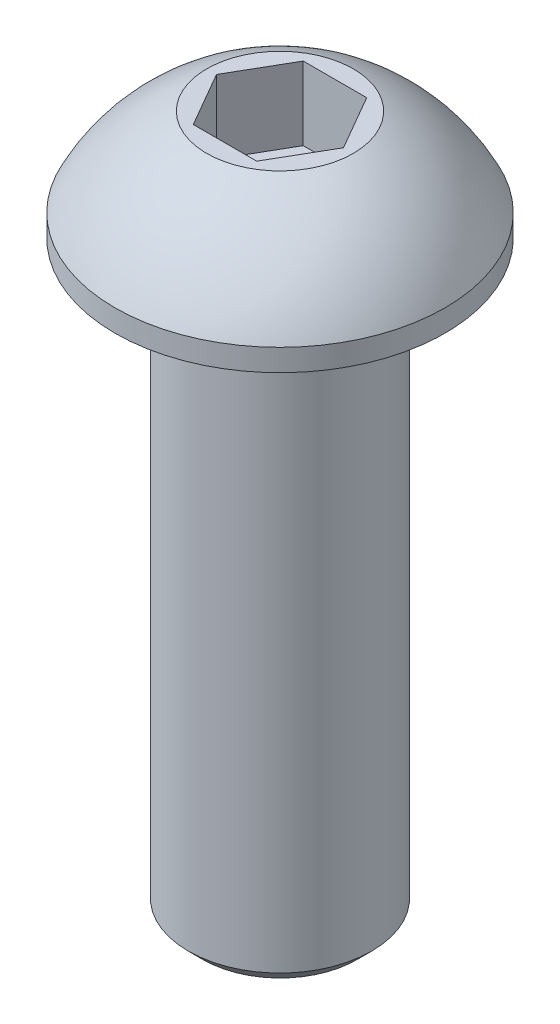
ISO-10303-21;
HEADER;
FILE_DESCRIPTION(('STEP AP214'),'2;1');
FILE_NAME('part.step','',(''),(''),'','','');
FILE_SCHEMA(('AUTOMOTIVE_DESIGN { 1 0 10303 214 1 1 1 1 }'));
ENDSEC;
DATA;
#1=APPLICATION_CONTEXT('core data for automotive mechanical design processes');
#2=APPLICATION_PROTOCOL_DEFINITION('international standard','automotive_design',2000,#1);
#3=PRODUCT_CONTEXT('',#1,'mechanical');
#4=PRODUCT('Part','Part','',(#3));
#5=PRODUCT_RELATED_PRODUCT_CATEGORY('part','',(#4));
#6=PRODUCT_DEFINITION_FORMATION('','',#4);
#7=PRODUCT_DEFINITION_CONTEXT('part definition',#1,'design');
#8=PRODUCT_DEFINITION('design','',#6,#7);
#9=PRODUCT_DEFINITION_SHAPE('','',#8);
#10=(LENGTH_UNIT() NAMED_UNIT(*) SI_UNIT(.MILLI.,.METRE.));
#11=(NAMED_UNIT(*) PLANE_ANGLE_UNIT() SI_UNIT($,.RADIAN.));
#12=(NAMED_UNIT(*) SI_UNIT($,.STERADIAN.) SOLID_ANGLE_UNIT());
#13=UNCERTAINTY_MEASURE_WITH_UNIT(LENGTH_MEASURE(1.E-05),#10,'distance_accuracy_value','');
#14=(GEOMETRIC_REPRESENTATION_CONTEXT(3) GLOBAL_UNCERTAINTY_ASSIGNED_CONTEXT((#13)) GLOBAL_UNIT_ASSIGNED_CONTEXT((#10,
#11,#12)) REPRESENTATION_CONTEXT('',''));
#15=CARTESIAN_POINT('',(0.,0.,0.));
#16=DIRECTION('',(0.,0.,1.));
#17=DIRECTION('',(1.,0.,0.));
#18=AXIS2_PLACEMENT_3D('',#15,#16,#17);
#19=CARTESIAN_POINT('',(0.,1.5,0.));
#20=DIRECTION('',(0.,-1.,0.));
#21=DIRECTION('',(0.,0.,-1.));
#22=AXIS2_PLACEMENT_3D('',#19,#20,#21);
#23=PLANE('',#22);
#24=CARTESIAN_POINT('',(0.,1.5,0.));
#25=DIRECTION('',(0.,1.,0.));
#26=DIRECTION('',(0.,0.,1.));
#27=AXIS2_PLACEMENT_3D('',#24,#25,#26);
#28=CIRCLE('',#27,1.);
#29=CARTESIAN_POINT('',(1.,1.5,0.));
#30=VERTEX_POINT('',#29);
#31=EDGE_CURVE('E133',#30,#30,#28,.T.);
#32=ORIENTED_EDGE('',*,*,#31,.T.);
#33=EDGE_LOOP('',(#32));
#34=FACE_BOUND('',#33,.T.);
#35=DIRECTION('',(1.,0.,0.));
#36=VECTOR('',#35,1.);
#37=CARTESIAN_POINT('',(0.,1.5,0.75));
#38=LINE('',#37,#36);
#39=CARTESIAN_POINT('',(-0.43301270189222,1.5,0.75));
#40=VERTEX_POINT('',#39);
#41=CARTESIAN_POINT('',(0.433012701892219,1.5,0.75));
#42=VERTEX_POINT('',#41);
#43=EDGE_CURVE('E59',#40,#42,#38,.T.);
#44=ORIENTED_EDGE('',*,*,#43,.F.);
#45=DIRECTION('',(0.5,0.,0.866025403784439));
#46=VECTOR('',#45,1.);
#47=CARTESIAN_POINT('',(-0.649519052838329,1.5,0.375000000000001));
#48=LINE('',#47,#46);
#49=CARTESIAN_POINT('',(-0.866025403784439,1.5,0.));
#50=VERTEX_POINT('',#49);
#51=EDGE_CURVE('E142',#50,#40,#48,.T.);
#52=ORIENTED_EDGE('',*,*,#51,.F.);
#53=DIRECTION('',(-0.5,0.,0.866025403784439));
#54=VECTOR('',#53,1.);
#55=CARTESIAN_POINT('',(-0.649519052838329,1.5,-0.375000000000001));
#56=LINE('',#55,#54);
#57=CARTESIAN_POINT('',(-0.43301270189222,1.5,-0.75));
#58=VERTEX_POINT('',#57);
#59=EDGE_CURVE('E144',#58,#50,#56,.T.);
#60=ORIENTED_EDGE('',*,*,#59,.F.);
#61=DIRECTION('',(-1.,0.,0.));
#62=VECTOR('',#61,1.);
#63=CARTESIAN_POINT('',(0.,1.5,-0.75));
#64=LINE('',#63,#62);
#65=CARTESIAN_POINT('',(0.433012701892219,1.5,-0.75));
#66=VERTEX_POINT('',#65);
#67=EDGE_CURVE('E146',#66,#58,#64,.T.);
#68=ORIENTED_EDGE('',*,*,#67,.F.);
#69=DIRECTION('',(-0.5,0.,-0.866025403784438));
#70=VECTOR('',#69,1.);
#71=CARTESIAN_POINT('',(0.649519052838329,1.5,-0.375));
#72=LINE('',#71,#70);
#73=CARTESIAN_POINT('',(0.866025403784439,1.5,0.));
#74=VERTEX_POINT('',#73);
#75=EDGE_CURVE('E148',#74,#66,#72,.T.);
#76=ORIENTED_EDGE('',*,*,#75,.F.);
#77=DIRECTION('',(0.5,0.,-0.866025403784439));
#78=VECTOR('',#77,1.);
#79=CARTESIAN_POINT('',(0.649519052838329,1.5,0.374999999999999));
#80=LINE('',#79,#78);
#81=EDGE_CURVE('E150',#42,#74,#80,.T.);
#82=ORIENTED_EDGE('',*,*,#81,.F.);
#83=EDGE_LOOP('',(#44,#52,#60,#68,#76,#82));
#84=FACE_BOUND('',#83,.T.);
#85=ADVANCED_FACE('F36',(#34,#84),#23,.F.);
#86=CARTESIAN_POINT('',(0.,21.344098616689,0.));
#87=DIRECTION('',(0.,1.,0.));
#88=DIRECTION('',(0.,0.,1.));
#89=AXIS2_PLACEMENT_3D('',#86,#87,#88);
#90=CYLINDRICAL_SURFACE('',#89,1.25);
#91=CARTESIAN_POINT('',(0.,-0.199999999999999,0.));
#92=DIRECTION('',(0.,1.,0.));
#93=DIRECTION('',(0.,0.,1.));
#94=AXIS2_PLACEMENT_3D('',#91,#92,#93);
#95=CIRCLE('',#94,1.25);
#96=CARTESIAN_POINT('',(0.,-0.199999999999999,1.25));
#97=VERTEX_POINT('',#96);
#98=EDGE_CURVE('E11',#97,#97,#95,.F.);
#99=ORIENTED_EDGE('',*,*,#98,.T.);
#100=EDGE_LOOP('',(#99));
#101=FACE_BOUND('',#100,.T.);
#102=CARTESIAN_POINT('',(0.,-7.8,0.));
#103=DIRECTION('',(0.,1.,0.));
#104=DIRECTION('',(0.,0.,1.));
#105=AXIS2_PLACEMENT_3D('',#102,#103,#104);
#106=CIRCLE('',#105,1.25);
#107=CARTESIAN_POINT('',(0.,-7.8,1.25));
#108=VERTEX_POINT('',#107);
#109=EDGE_CURVE('E136',#108,#108,#106,.T.);
#110=ORIENTED_EDGE('',*,*,#109,.T.);
#111=EDGE_LOOP('',(#110));
#112=FACE_BOUND('',#111,.T.);
#113=ADVANCED_FACE('F167',(#101,#112),#90,.T.);
#114=CARTESIAN_POINT('',(1.25,-8.,0.));
#115=DIRECTION('',(0.,1.,0.));
#116=DIRECTION('',(0.,0.,1.));
#117=AXIS2_PLACEMENT_3D('',#114,#115,#116);
#118=PLANE('',#117);
#119=CARTESIAN_POINT('',(0.,-8.,0.));
#120=DIRECTION('',(0.,1.,0.));
#121=DIRECTION('',(0.,0.,1.));
#122=AXIS2_PLACEMENT_3D('',#119,#120,#121);
#123=CIRCLE('',#122,1.05);
#124=CARTESIAN_POINT('',(0.,-8.,1.05));
#125=VERTEX_POINT('',#124);
#126=EDGE_CURVE('E139',#125,#125,#123,.F.);
#127=ORIENTED_EDGE('',*,*,#126,.T.);
#128=EDGE_LOOP('',(#127));
#129=FACE_BOUND('',#128,.T.);
#130=ADVANCED_FACE('F173',(#129),#118,.F.);
#131=CARTESIAN_POINT('',(0.,-0.792708333333331,0.));
#132=DIRECTION('',(0.,1.,0.));
#133=DIRECTION('',(1.,0.,0.));
#134=AXIS2_PLACEMENT_3D('',#131,#132,#133);
#135=SPHERICAL_SURFACE('',#134,2.50130196132656);
#136=CARTESIAN_POINT('',(0.,0.300000000000002,0.));
#137=DIRECTION('',(0.,1.,0.));
#138=DIRECTION('',(0.,0.,1.));
#139=AXIS2_PLACEMENT_3D('',#136,#137,#138);
#140=CIRCLE('',#139,2.25);
#141=CARTESIAN_POINT('',(2.25,0.300000000000001,0.));
#142=VERTEX_POINT('',#141);
#143=EDGE_CURVE('E130',#142,#142,#140,.T.);
#144=CARTESIAN_POINT('',(1.,1.5,0.));
#145=CARTESIAN_POINT('',(1.01689455979578,1.4926312169149,0.));
#146=CARTESIAN_POINT('',(1.03370764110376,1.48507563084587,0.));
#147=CARTESIAN_POINT('',(1.06716269655597,1.4695946874786,0.));
#148=CARTESIAN_POINT('',(1.08380467070021,1.46166933018036,0.));
#149=CARTESIAN_POINT('',(1.11690936163676,1.4454526790933,0.));
#150=CARTESIAN_POINT('',(1.13337207842908,1.43716138530449,0.));
#151=CARTESIAN_POINT('',(1.16611021447703,1.42021692321685,0.));
#152=CARTESIAN_POINT('',(1.18238563373266,1.41156375491803,0.));
#153=CARTESIAN_POINT('',(1.21474122004677,1.39389976965647,0.));
#154=CARTESIAN_POINT('',(1.23082138710524,1.38488895269373,0.));
#155=CARTESIAN_POINT('',(1.262778611388,1.36651407420066,0.));
#156=CARTESIAN_POINT('',(1.2786556686123,1.35715001267033,0.));
#157=CARTESIAN_POINT('',(1.31019891441342,1.33807322082877,0.));
#158=CARTESIAN_POINT('',(1.32586510299023,1.32836049051754,0.));
#159=CARTESIAN_POINT('',(1.35697895584482,1.30859110753619,0.));
#160=CARTESIAN_POINT('',(1.37242662012259,1.29853445486607,0.));
#161=CARTESIAN_POINT('',(1.40309587548394,1.27808214158837,0.));
#162=CARTESIAN_POINT('',(1.41831746656753,1.26768648098079,0.));
#163=CARTESIAN_POINT('',(1.44852713713003,1.24656123193225,0.));
#164=CARTESIAN_POINT('',(1.46351521660893,1.23583164349128,0.));
#165=CARTESIAN_POINT('',(1.49325053966064,1.21404378205745,0.));
#166=CARTESIAN_POINT('',(1.50799778323344,1.20298550906459,0.));
#167=CARTESIAN_POINT('',(1.5372442278626,1.18054568242968,0.));
#168=CARTESIAN_POINT('',(1.55174342891897,1.16916412878764,0.));
#169=CARTESIAN_POINT('',(1.58048670311699,1.14608330273596,0.));
#170=CARTESIAN_POINT('',(1.59473077625865,1.13438403032631,0.));
#171=CARTESIAN_POINT('',(1.62295683390366,1.11067348388234,0.));
#172=CARTESIAN_POINT('',(1.63693881840701,1.09866220984801,0.));
#173=CARTESIAN_POINT('',(1.664633866128,1.07433352976497,0.));
#174=CARTESIAN_POINT('',(1.67834692934564,1.06201612371626,0.));
#175=CARTESIAN_POINT('',(1.70549743326292,1.03708119881385,0.));
#176=CARTESIAN_POINT('',(1.71893487396257,1.02446367996016,0.));
#177=CARTESIAN_POINT('',(1.74552756630144,0.998934695314842,0.));
#178=CARTESIAN_POINT('',(1.75868281794067,0.986023229523216,0.));
#179=CARTESIAN_POINT('',(1.78470470351505,0.959912660513622,0.));
#180=CARTESIAN_POINT('',(1.7975713374502,0.946713557295655,0.));
#181=CARTESIAN_POINT('',(1.82300970001305,0.920034163506213,0.));
#182=CARTESIAN_POINT('',(1.83558142864074,0.906553872934738,0.));
#183=CARTESIAN_POINT('',(1.86042383709817,0.879318691920372,0.));
#184=CARTESIAN_POINT('',(1.87269451692791,0.86556380147748,0.));
#185=CARTESIAN_POINT('',(1.89692883141394,0.837786142392471,0.));
#186=CARTESIAN_POINT('',(1.90889246607023,0.823763373750354,0.));
#187=CARTESIAN_POINT('',(1.93250684387932,0.795456810844534,0.));
#188=CARTESIAN_POINT('',(1.94415758703212,0.781173016580831,0.));
#189=CARTESIAN_POINT('',(1.96714048840608,0.752351382566021,0.));
#190=CARTESIAN_POINT('',(1.97847264662725,0.737813542814915,0.));
#191=CARTESIAN_POINT('',(2.00081284039562,0.708490922105827,0.));
#192=CARTESIAN_POINT('',(2.01182087594283,0.693706141147845,0.));
#193=CARTESIAN_POINT('',(2.0335074450069,0.663896862977135,0.));
#194=CARTESIAN_POINT('',(2.04418597852376,0.648872365764407,0.));
#195=CARTESIAN_POINT('',(2.06520832520777,0.618590997188706,0.));
#196=CARTESIAN_POINT('',(2.07555213837491,0.603334125825734,0.));
#197=CARTESIAN_POINT('',(2.09589998954404,0.572595464575858,0.));
#198=CARTESIAN_POINT('',(2.10590402754603,0.557113674688954,0.));
#199=CARTESIAN_POINT('',(2.12556743985372,0.525932742055182,0.));
#200=CARTESIAN_POINT('',(2.13522681415943,0.510233599308315,0.));
#201=CARTESIAN_POINT('',(2.1541961780589,0.478625632364845,0.));
#202=CARTESIAN_POINT('',(2.16350616765266,0.462716808168244,0.));
#203=CARTESIAN_POINT('',(2.18177221525592,0.430697253950716,0.));
#204=CARTESIAN_POINT('',(2.19072827326541,0.41458652392979,0.));
#205=CARTESIAN_POINT('',(2.20828207106755,0.382171025827712,0.));
#206=CARTESIAN_POINT('',(2.21687981086018,0.365866257746559,0.));
#207=CARTESIAN_POINT('',(2.23371280816067,0.333070670471238,0.));
#208=CARTESIAN_POINT('',(2.24194806566852,0.316579851277071,0.));
#209=CARTESIAN_POINT('',(2.25,0.300000000000001,0.));
#210=B_SPLINE_CURVE_WITH_KNOTS('',3,(#144,#145,#146,#147,#148,#149,#150,#151,#152,#153,#154,
#155,#156,#157,#158,#159,#160,#161,#162,#163,#164,#165,#166,#167,#168,#169,#170,#171,#172,#173,
#174,#175,#176,#177,#178,#179,#180,#181,#182,#183,#184,#185,#186,#187,#188,#189,#190,#191,#192,
#193,#194,#195,#196,#197,#198,#199,#200,#201,#202,#203,#204,#205,#206,#207,#208,#209),
.UNSPECIFIED.,.F.,.F.,(4,2,2,2,2,2,2,2,2,2,2,2,2,2,2,2,2,2,2,2,2,2,2,2,2,2,2,2,2,2,2,2,4),(0.,
0.0552937723898259,0.110587544779652,0.165881317169478,0.221175089559305,0.276468861949131,
0.331762634338957,0.387056406728783,0.442350179118609,0.497643951508435,0.552937723898262,
0.608231496288088,0.663525268677914,0.71881904106774,0.774112813457566,0.829406585847393,
0.884700358237219,0.939994130627045,0.995287903016871,1.0505816754067,1.10587544779652,
1.16116922018635,1.21646299257618,1.271756764966,1.32705053735583,1.38234430974565,
1.43763808213548,1.49293185452531,1.54822562691513,1.60351939930496,1.65881317169479,
1.71410694408461,1.76940071647444),.UNSPECIFIED.);
#211=EDGE_CURVE('BSEAM179',#30,#142,#210,.T.);
#212=ORIENTED_EDGE('',*,*,#31,.F.);
#213=ORIENTED_EDGE('',*,*,#143,.T.);
#214=ORIENTED_EDGE('',*,*,#211,.T.);
#215=ORIENTED_EDGE('',*,*,#211,.F.);
#216=EDGE_LOOP('',(#212,#214,#213,#215));
#217=FACE_BOUND('',#216,.T.);
#218=ADVANCED_FACE('F179',(#217),#135,.T.);
#219=CARTESIAN_POINT('',(0.,21.344098616689,0.));
#220=DIRECTION('',(0.,1.,0.));
#221=DIRECTION('',(0.,0.,1.));
#222=AXIS2_PLACEMENT_3D('',#219,#220,#221);
#223=CYLINDRICAL_SURFACE('',#222,2.25);
#224=ORIENTED_EDGE('',*,*,#143,.F.);
#225=EDGE_LOOP('',(#224));
#226=FACE_BOUND('',#225,.T.);
#227=CARTESIAN_POINT('',(0.,0.,0.));
#228=DIRECTION('',(0.,1.,0.));
#229=DIRECTION('',(0.,0.,1.));
#230=AXIS2_PLACEMENT_3D('',#227,#228,#229);
#231=CIRCLE('',#230,2.25);
#232=CARTESIAN_POINT('',(0.,0.,2.25));
#233=VERTEX_POINT('',#232);
#234=EDGE_CURVE('E95',#233,#233,#231,.T.);
#235=ORIENTED_EDGE('',*,*,#234,.T.);
#236=EDGE_LOOP('',(#235));
#237=FACE_BOUND('',#236,.T.);
#238=ADVANCED_FACE('F191',(#226,#237),#223,.T.);
#239=CARTESIAN_POINT('',(1.25,0.,0.));
#240=DIRECTION('',(0.,1.,0.));
#241=DIRECTION('',(0.,0.,1.));
#242=AXIS2_PLACEMENT_3D('',#239,#240,#241);
#243=PLANE('',#242);
#244=CARTESIAN_POINT('',(0.,0.,0.));
#245=DIRECTION('',(0.,1.,0.));
#246=DIRECTION('',(0.,0.,1.));
#247=AXIS2_PLACEMENT_3D('',#244,#245,#246);
#248=CIRCLE('',#247,1.45);
#249=CARTESIAN_POINT('',(0.,0.,1.45));
#250=VERTEX_POINT('',#249);
#251=EDGE_CURVE('E44',#250,#250,#248,.T.);
#252=ORIENTED_EDGE('',*,*,#251,.T.);
#253=EDGE_LOOP('',(#252));
#254=FACE_BOUND('',#253,.T.);
#255=ORIENTED_EDGE('',*,*,#234,.F.);
#256=EDGE_LOOP('',(#255));
#257=FACE_BOUND('',#256,.T.);
#258=ADVANCED_FACE('F155',(#254,#257),#243,.F.);
#259=CARTESIAN_POINT('',(0.,-7.8,0.));
#260=DIRECTION('',(0.,1.,0.));
#261=DIRECTION('',(0.,0.,1.));
#262=AXIS2_PLACEMENT_3D('',#259,#260,#261);
#263=CONICAL_SURFACE('',#262,1.25,0.785398163397449);
#264=ORIENTED_EDGE('',*,*,#126,.F.);
#265=EDGE_LOOP('',(#264));
#266=FACE_BOUND('',#265,.T.);
#267=ORIENTED_EDGE('',*,*,#109,.F.);
#268=EDGE_LOOP('',(#267));
#269=FACE_BOUND('',#268,.T.);
#270=ADVANCED_FACE('F183',(#266,#269),#263,.T.);
#271=CARTESIAN_POINT('',(-0.43301270189222,10.5,0.75));
#272=DIRECTION('',(0.,0.,-1.));
#273=DIRECTION('',(-1.,0.,0.));
#274=AXIS2_PLACEMENT_3D('',#271,#272,#273);
#275=PLANE('',#274);
#276=ORIENTED_EDGE('',*,*,#43,.T.);
#277=DIRECTION('',(0.,-1.,0.));
#278=VECTOR('',#277,1.);
#279=CARTESIAN_POINT('',(0.433012701892219,10.5,0.75));
#280=LINE('',#279,#278);
#281=CARTESIAN_POINT('',(0.433012701892219,0.5,0.75));
#282=VERTEX_POINT('',#281);
#283=EDGE_CURVE('E88',#42,#282,#280,.T.);
#284=ORIENTED_EDGE('',*,*,#283,.T.);
#285=DIRECTION('',(1.,0.,0.));
#286=VECTOR('',#285,1.);
#287=CARTESIAN_POINT('',(-0.43301270189222,0.5,0.75));
#288=LINE('',#287,#286);
#289=CARTESIAN_POINT('',(-0.43301270189222,0.5,0.75));
#290=VERTEX_POINT('',#289);
#291=EDGE_CURVE('E92',#290,#282,#288,.T.);
#292=ORIENTED_EDGE('',*,*,#291,.F.);
#293=DIRECTION('',(0.,-1.,0.));
#294=VECTOR('',#293,1.);
#295=CARTESIAN_POINT('',(-0.43301270189222,10.5,0.75));
#296=LINE('',#295,#294);
#297=EDGE_CURVE('E120',#40,#290,#296,.T.);
#298=ORIENTED_EDGE('',*,*,#297,.F.);
#299=EDGE_LOOP('',(#276,#284,#292,#298));
#300=FACE_BOUND('',#299,.T.);
#301=ADVANCED_FACE('F90',(#300),#275,.T.);
#302=CARTESIAN_POINT('',(0.433012701892219,10.5,0.75));
#303=DIRECTION('',(-0.866025403784439,0.,-0.5));
#304=DIRECTION('',(-0.5,0.,0.866025403784439));
#305=AXIS2_PLACEMENT_3D('',#302,#303,#304);
#306=PLANE('',#305);
#307=ORIENTED_EDGE('',*,*,#81,.T.);
#308=DIRECTION('',(0.,-1.,0.));
#309=VECTOR('',#308,1.);
#310=CARTESIAN_POINT('',(0.866025403784439,10.5,0.));
#311=LINE('',#310,#309);
#312=CARTESIAN_POINT('',(0.866025403784439,0.5,0.));
#313=VERTEX_POINT('',#312);
#314=EDGE_CURVE('E96',#74,#313,#311,.T.);
#315=ORIENTED_EDGE('',*,*,#314,.T.);
#316=DIRECTION('',(0.5,0.,-0.866025403784439));
#317=VECTOR('',#316,1.);
#318=CARTESIAN_POINT('',(0.433012701892219,0.5,0.75));
#319=LINE('',#318,#317);
#320=EDGE_CURVE('E99',#282,#313,#319,.T.);
#321=ORIENTED_EDGE('',*,*,#320,.F.);
#322=ORIENTED_EDGE('',*,*,#283,.F.);
#323=EDGE_LOOP('',(#307,#315,#321,#322));
#324=FACE_BOUND('',#323,.T.);
#325=ADVANCED_FACE('F100',(#324),#306,.T.);
#326=CARTESIAN_POINT('',(0.866025403784439,10.5,0.));
#327=DIRECTION('',(-0.866025403784438,0.,0.5));
#328=DIRECTION('',(0.5,0.,0.866025403784438));
#329=AXIS2_PLACEMENT_3D('',#326,#327,#328);
#330=PLANE('',#329);
#331=ORIENTED_EDGE('',*,*,#75,.T.);
#332=DIRECTION('',(0.,-1.,0.));
#333=VECTOR('',#332,1.);
#334=CARTESIAN_POINT('',(0.433012701892219,10.5,-0.75));
#335=LINE('',#334,#333);
#336=CARTESIAN_POINT('',(0.433012701892219,0.5,-0.75));
#337=VERTEX_POINT('',#336);
#338=EDGE_CURVE('E125',#66,#337,#335,.T.);
#339=ORIENTED_EDGE('',*,*,#338,.T.);
#340=DIRECTION('',(-0.5,0.,-0.866025403784438));
#341=VECTOR('',#340,1.);
#342=CARTESIAN_POINT('',(0.866025403784439,0.5,0.));
#343=LINE('',#342,#341);
#344=EDGE_CURVE('E105',#313,#337,#343,.T.);
#345=ORIENTED_EDGE('',*,*,#344,.F.);
#346=ORIENTED_EDGE('',*,*,#314,.F.);
#347=EDGE_LOOP('',(#331,#339,#345,#346));
#348=FACE_BOUND('',#347,.T.);
#349=ADVANCED_FACE('F204',(#348),#330,.T.);
#350=CARTESIAN_POINT('',(0.433012701892219,10.5,-0.75));
#351=DIRECTION('',(0.,0.,1.));
#352=DIRECTION('',(1.,0.,0.));
#353=AXIS2_PLACEMENT_3D('',#350,#351,#352);
#354=PLANE('',#353);
#355=ORIENTED_EDGE('',*,*,#67,.T.);
#356=DIRECTION('',(0.,-1.,0.));
#357=VECTOR('',#356,1.);
#358=CARTESIAN_POINT('',(-0.43301270189222,10.5,-0.75));
#359=LINE('',#358,#357);
#360=CARTESIAN_POINT('',(-0.43301270189222,0.5,-0.75));
#361=VERTEX_POINT('',#360);
#362=EDGE_CURVE('E123',#58,#361,#359,.T.);
#363=ORIENTED_EDGE('',*,*,#362,.T.);
#364=DIRECTION('',(-1.,0.,0.));
#365=VECTOR('',#364,1.);
#366=CARTESIAN_POINT('',(0.433012701892219,0.5,-0.75));
#367=LINE('',#366,#365);
#368=EDGE_CURVE('E114',#337,#361,#367,.T.);
#369=ORIENTED_EDGE('',*,*,#368,.F.);
#370=ORIENTED_EDGE('',*,*,#338,.F.);
#371=EDGE_LOOP('',(#355,#363,#369,#370));
#372=FACE_BOUND('',#371,.T.);
#373=ADVANCED_FACE('F207',(#372),#354,.T.);
#374=CARTESIAN_POINT('',(-0.43301270189222,10.5,-0.75));
#375=DIRECTION('',(0.866025403784439,0.,0.5));
#376=DIRECTION('',(0.5,0.,-0.866025403784439));
#377=AXIS2_PLACEMENT_3D('',#374,#375,#376);
#378=PLANE('',#377);
#379=ORIENTED_EDGE('',*,*,#59,.T.);
#380=DIRECTION('',(0.,-1.,0.));
#381=VECTOR('',#380,1.);
#382=CARTESIAN_POINT('',(-0.866025403784439,10.5,0.));
#383=LINE('',#382,#381);
#384=CARTESIAN_POINT('',(-0.866025403784439,0.5,0.));
#385=VERTEX_POINT('',#384);
#386=EDGE_CURVE('E51',#50,#385,#383,.T.);
#387=ORIENTED_EDGE('',*,*,#386,.T.);
#388=DIRECTION('',(-0.5,0.,0.866025403784439));
#389=VECTOR('',#388,1.);
#390=CARTESIAN_POINT('',(-0.43301270189222,0.5,-0.75));
#391=LINE('',#390,#389);
#392=EDGE_CURVE('E117',#361,#385,#391,.T.);
#393=ORIENTED_EDGE('',*,*,#392,.F.);
#394=ORIENTED_EDGE('',*,*,#362,.F.);
#395=EDGE_LOOP('',(#379,#387,#393,#394));
#396=FACE_BOUND('',#395,.T.);
#397=ADVANCED_FACE('F211',(#396),#378,.T.);
#398=CARTESIAN_POINT('',(-0.866025403784439,10.5,0.));
#399=DIRECTION('',(0.866025403784439,0.,-0.5));
#400=DIRECTION('',(-0.5,0.,-0.866025403784439));
#401=AXIS2_PLACEMENT_3D('',#398,#399,#400);
#402=PLANE('',#401);
#403=ORIENTED_EDGE('',*,*,#51,.T.);
#404=ORIENTED_EDGE('',*,*,#297,.T.);
#405=DIRECTION('',(0.5,0.,0.866025403784438));
#406=VECTOR('',#405,1.);
#407=CARTESIAN_POINT('',(-0.866025403784439,0.5,0.));
#408=LINE('',#407,#406);
#409=EDGE_CURVE('E110',#385,#290,#408,.T.);
#410=ORIENTED_EDGE('',*,*,#409,.F.);
#411=ORIENTED_EDGE('',*,*,#386,.F.);
#412=EDGE_LOOP('',(#403,#404,#410,#411));
#413=FACE_BOUND('',#412,.T.);
#414=ADVANCED_FACE('F163',(#413),#402,.T.);
#415=CARTESIAN_POINT('',(0.,0.5,0.));
#416=DIRECTION('',(0.,1.,0.));
#417=DIRECTION('',(0.,0.,1.));
#418=AXIS2_PLACEMENT_3D('',#415,#416,#417);
#419=PLANE('',#418);
#420=ORIENTED_EDGE('',*,*,#291,.T.);
#421=ORIENTED_EDGE('',*,*,#320,.T.);
#422=ORIENTED_EDGE('',*,*,#344,.T.);
#423=ORIENTED_EDGE('',*,*,#368,.T.);
#424=ORIENTED_EDGE('',*,*,#392,.T.);
#425=ORIENTED_EDGE('',*,*,#409,.T.);
#426=EDGE_LOOP('',(#420,#421,#422,#423,#424,#425));
#427=FACE_BOUND('',#426,.T.);
#428=ADVANCED_FACE('F108',(#427),#419,.T.);
#429=CARTESIAN_POINT('',(0.,-0.199999999999999,0.));
#430=DIRECTION('',(0.,1.,0.));
#431=DIRECTION('',(0.,0.,1.));
#432=AXIS2_PLACEMENT_3D('',#429,#430,#431);
#433=TOROIDAL_SURFACE('',#432,1.45,0.2);
#434=ORIENTED_EDGE('',*,*,#98,.F.);
#435=EDGE_LOOP('',(#434));
#436=FACE_BOUND('',#435,.T.);
#437=ORIENTED_EDGE('',*,*,#251,.F.);
#438=EDGE_LOOP('',(#437));
#439=FACE_BOUND('',#438,.T.);
#440=ADVANCED_FACE('F38',(#436,#439),#433,.F.);
#441=CLOSED_SHELL('',(#85,#113,#130,#218,#238,#258,#270,#301,#325,#349,#373,#397,#414,#428,#440));
#442=MANIFOLD_SOLID_BREP('B2',#441);
#443=ADVANCED_BREP_SHAPE_REPRESENTATION('',(#18,#442),#14);
#444=SHAPE_DEFINITION_REPRESENTATION(#9,#443);
ENDSEC;
END-ISO-10303-21;
